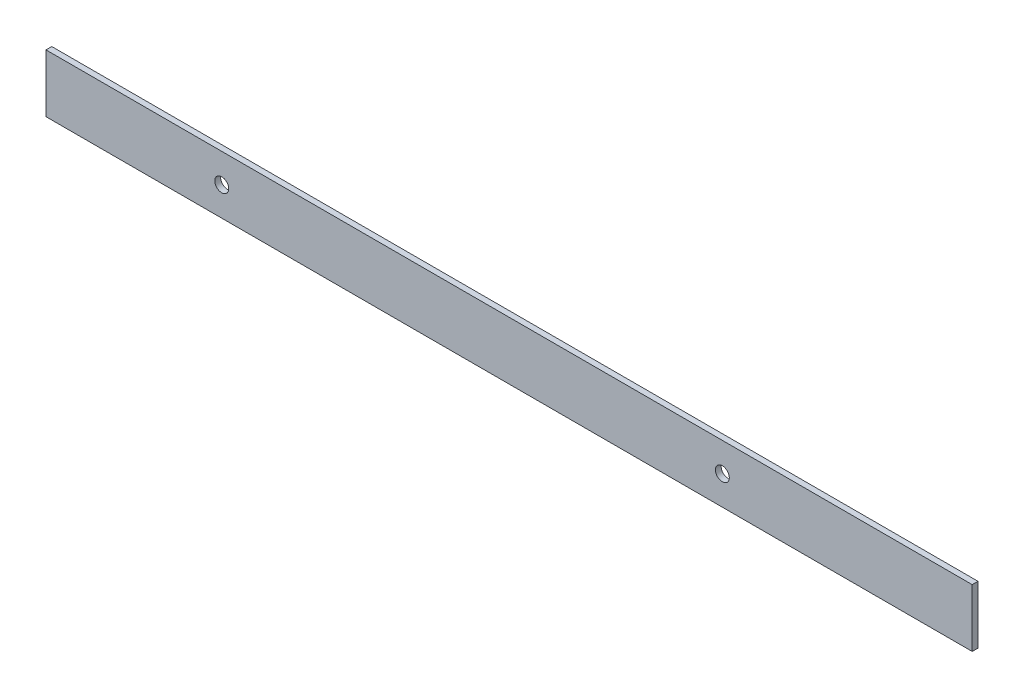
ISO-10303-21;
HEADER;
FILE_DESCRIPTION(('STEP AP214'),'2;1');
FILE_NAME('part.step','',(''),(''),'','','');
FILE_SCHEMA(('AUTOMOTIVE_DESIGN { 1 0 10303 214 1 1 1 1 }'));
ENDSEC;
DATA;
#1=APPLICATION_CONTEXT('core data for automotive mechanical design processes');
#2=APPLICATION_PROTOCOL_DEFINITION('international standard','automotive_design',2000,#1);
#3=PRODUCT_CONTEXT('',#1,'mechanical');
#4=PRODUCT('Part','Part','',(#3));
#5=PRODUCT_RELATED_PRODUCT_CATEGORY('part','',(#4));
#6=PRODUCT_DEFINITION_FORMATION('','',#4);
#7=PRODUCT_DEFINITION_CONTEXT('part definition',#1,'design');
#8=PRODUCT_DEFINITION('design','',#6,#7);
#9=PRODUCT_DEFINITION_SHAPE('','',#8);
#10=(LENGTH_UNIT() NAMED_UNIT(*) SI_UNIT(.MILLI.,.METRE.));
#11=(NAMED_UNIT(*) PLANE_ANGLE_UNIT() SI_UNIT($,.RADIAN.));
#12=(NAMED_UNIT(*) SI_UNIT($,.STERADIAN.) SOLID_ANGLE_UNIT());
#13=UNCERTAINTY_MEASURE_WITH_UNIT(LENGTH_MEASURE(1.E-05),#10,'distance_accuracy_value','');
#14=(GEOMETRIC_REPRESENTATION_CONTEXT(3) GLOBAL_UNCERTAINTY_ASSIGNED_CONTEXT((#13)) GLOBAL_UNIT_ASSIGNED_CONTEXT((#10,
#11,#12)) REPRESENTATION_CONTEXT('',''));
#15=CARTESIAN_POINT('',(0.,0.,0.));
#16=DIRECTION('',(0.,0.,1.));
#17=DIRECTION('',(1.,0.,0.));
#18=AXIS2_PLACEMENT_3D('',#15,#16,#17);
#19=CARTESIAN_POINT('',(0.,50.,5.));
#20=DIRECTION('',(0.,1.,0.));
#21=DIRECTION('',(0.,0.,1.));
#22=AXIS2_PLACEMENT_3D('',#19,#20,#21);
#23=PLANE('',#22);
#24=DIRECTION('',(1.,0.,0.));
#25=VECTOR('',#24,1.);
#26=CARTESIAN_POINT('',(0.,50.,0.));
#27=LINE('',#26,#25);
#28=CARTESIAN_POINT('',(0.,50.,0.));
#29=VERTEX_POINT('',#28);
#30=CARTESIAN_POINT('',(800.,50.,0.));
#31=VERTEX_POINT('',#30);
#32=EDGE_CURVE('E117',#29,#31,#27,.T.);
#33=ORIENTED_EDGE('',*,*,#32,.F.);
#34=DIRECTION('',(0.,0.,-1.));
#35=VECTOR('',#34,1.);
#36=CARTESIAN_POINT('',(0.,50.,5.));
#37=LINE('',#36,#35);
#38=CARTESIAN_POINT('',(0.,50.,5.));
#39=VERTEX_POINT('',#38);
#40=EDGE_CURVE('E11',#39,#29,#37,.T.);
#41=ORIENTED_EDGE('',*,*,#40,.F.);
#42=DIRECTION('',(1.,0.,0.));
#43=VECTOR('',#42,1.);
#44=CARTESIAN_POINT('',(0.,50.,5.));
#45=LINE('',#44,#43);
#46=CARTESIAN_POINT('',(800.,50.,5.));
#47=VERTEX_POINT('',#46);
#48=EDGE_CURVE('E101',#39,#47,#45,.T.);
#49=ORIENTED_EDGE('',*,*,#48,.T.);
#50=DIRECTION('',(0.,0.,-1.));
#51=VECTOR('',#50,1.);
#52=CARTESIAN_POINT('',(800.,50.,5.));
#53=LINE('',#52,#51);
#54=EDGE_CURVE('E78',#47,#31,#53,.T.);
#55=ORIENTED_EDGE('',*,*,#54,.T.);
#56=EDGE_LOOP('',(#33,#41,#49,#55));
#57=FACE_BOUND('',#56,.T.);
#58=ADVANCED_FACE('F38',(#57),#23,.T.);
#59=CARTESIAN_POINT('',(0.,0.,5.));
#60=DIRECTION('',(-1.,0.,0.));
#61=DIRECTION('',(0.,0.,1.));
#62=AXIS2_PLACEMENT_3D('',#59,#60,#61);
#63=PLANE('',#62);
#64=DIRECTION('',(0.,1.,0.));
#65=VECTOR('',#64,1.);
#66=CARTESIAN_POINT('',(0.,0.,0.));
#67=LINE('',#66,#65);
#68=CARTESIAN_POINT('',(0.,0.,0.));
#69=VERTEX_POINT('',#68);
#70=EDGE_CURVE('E90',#69,#29,#67,.T.);
#71=ORIENTED_EDGE('',*,*,#70,.F.);
#72=DIRECTION('',(0.,0.,-1.));
#73=VECTOR('',#72,1.);
#74=CARTESIAN_POINT('',(0.,0.,5.));
#75=LINE('',#74,#73);
#76=CARTESIAN_POINT('',(0.,0.,5.));
#77=VERTEX_POINT('',#76);
#78=EDGE_CURVE('E47',#77,#69,#75,.T.);
#79=ORIENTED_EDGE('',*,*,#78,.F.);
#80=DIRECTION('',(0.,1.,0.));
#81=VECTOR('',#80,1.);
#82=CARTESIAN_POINT('',(0.,0.,5.));
#83=LINE('',#82,#81);
#84=EDGE_CURVE('E88',#77,#39,#83,.T.);
#85=ORIENTED_EDGE('',*,*,#84,.T.);
#86=ORIENTED_EDGE('',*,*,#40,.T.);
#87=EDGE_LOOP('',(#71,#79,#85,#86));
#88=FACE_BOUND('',#87,.T.);
#89=ADVANCED_FACE('F86',(#88),#63,.T.);
#90=CARTESIAN_POINT('',(0.,0.,5.));
#91=DIRECTION('',(0.,1.,0.));
#92=DIRECTION('',(0.,0.,1.));
#93=AXIS2_PLACEMENT_3D('',#90,#91,#92);
#94=PLANE('',#93);
#95=DIRECTION('',(1.,0.,0.));
#96=VECTOR('',#95,1.);
#97=CARTESIAN_POINT('',(0.,0.,0.));
#98=LINE('',#97,#96);
#99=CARTESIAN_POINT('',(800.,0.,0.));
#100=VERTEX_POINT('',#99);
#101=EDGE_CURVE('E121',#69,#100,#98,.T.);
#102=ORIENTED_EDGE('',*,*,#101,.T.);
#103=DIRECTION('',(0.,0.,-1.));
#104=VECTOR('',#103,1.);
#105=CARTESIAN_POINT('',(800.,0.,5.));
#106=LINE('',#105,#104);
#107=CARTESIAN_POINT('',(800.,0.,5.));
#108=VERTEX_POINT('',#107);
#109=EDGE_CURVE('E93',#108,#100,#106,.T.);
#110=ORIENTED_EDGE('',*,*,#109,.F.);
#111=DIRECTION('',(1.,0.,0.));
#112=VECTOR('',#111,1.);
#113=CARTESIAN_POINT('',(0.,0.,5.));
#114=LINE('',#113,#112);
#115=EDGE_CURVE('E95',#77,#108,#114,.T.);
#116=ORIENTED_EDGE('',*,*,#115,.F.);
#117=ORIENTED_EDGE('',*,*,#78,.T.);
#118=EDGE_LOOP('',(#102,#110,#116,#117));
#119=FACE_BOUND('',#118,.T.);
#120=ADVANCED_FACE('F96',(#119),#94,.F.);
#121=CARTESIAN_POINT('',(800.,0.,5.));
#122=DIRECTION('',(-1.,0.,0.));
#123=DIRECTION('',(0.,0.,1.));
#124=AXIS2_PLACEMENT_3D('',#121,#122,#123);
#125=PLANE('',#124);
#126=DIRECTION('',(0.,1.,0.));
#127=VECTOR('',#126,1.);
#128=CARTESIAN_POINT('',(800.,0.,0.));
#129=LINE('',#128,#127);
#130=EDGE_CURVE('E71',#100,#31,#129,.T.);
#131=ORIENTED_EDGE('',*,*,#130,.T.);
#132=ORIENTED_EDGE('',*,*,#54,.F.);
#133=DIRECTION('',(0.,1.,0.));
#134=VECTOR('',#133,1.);
#135=CARTESIAN_POINT('',(800.,0.,5.));
#136=LINE('',#135,#134);
#137=EDGE_CURVE('E55',#108,#47,#136,.T.);
#138=ORIENTED_EDGE('',*,*,#137,.F.);
#139=ORIENTED_EDGE('',*,*,#109,.T.);
#140=EDGE_LOOP('',(#131,#132,#138,#139));
#141=FACE_BOUND('',#140,.T.);
#142=ADVANCED_FACE('F131',(#141),#125,.F.);
#143=CARTESIAN_POINT('',(151.798792625695,25.0026800815724,5.));
#144=DIRECTION('',(0.,0.,-1.));
#145=DIRECTION('',(-1.,0.,0.));
#146=AXIS2_PLACEMENT_3D('',#143,#144,#145);
#147=CYLINDRICAL_SURFACE('',#146,6.00000000000002);
#148=CARTESIAN_POINT('',(151.798792625695,25.0026800815724,5.));
#149=DIRECTION('',(0.,0.,1.));
#150=DIRECTION('',(1.,0.,0.));
#151=AXIS2_PLACEMENT_3D('',#148,#149,#150);
#152=CIRCLE('',#151,6.00000000000002);
#153=CARTESIAN_POINT('',(157.798792625695,25.0026800815724,5.));
#154=VERTEX_POINT('',#153);
#155=EDGE_CURVE('E104',#154,#154,#152,.T.);
#156=ORIENTED_EDGE('',*,*,#155,.T.);
#157=EDGE_LOOP('',(#156));
#158=FACE_BOUND('',#157,.T.);
#159=CARTESIAN_POINT('',(151.798792625695,25.0026800815724,0.));
#160=DIRECTION('',(0.,0.,1.));
#161=DIRECTION('',(1.,0.,0.));
#162=AXIS2_PLACEMENT_3D('',#159,#160,#161);
#163=CIRCLE('',#162,6.00000000000002);
#164=CARTESIAN_POINT('',(157.798792625695,25.0026800815724,0.));
#165=VERTEX_POINT('',#164);
#166=EDGE_CURVE('E113',#165,#165,#163,.T.);
#167=ORIENTED_EDGE('',*,*,#166,.F.);
#168=EDGE_LOOP('',(#167));
#169=FACE_BOUND('',#168,.T.);
#170=ADVANCED_FACE('F40',(#158,#169),#147,.F.);
#171=CARTESIAN_POINT('',(584.176275293685,25.0026800815726,5.));
#172=DIRECTION('',(0.,0.,-1.));
#173=DIRECTION('',(-1.,0.,0.));
#174=AXIS2_PLACEMENT_3D('',#171,#172,#173);
#175=CYLINDRICAL_SURFACE('',#174,5.99999999999999);
#176=CARTESIAN_POINT('',(584.176275293685,25.0026800815726,5.));
#177=DIRECTION('',(0.,0.,1.));
#178=DIRECTION('',(1.,0.,0.));
#179=AXIS2_PLACEMENT_3D('',#176,#177,#178);
#180=CIRCLE('',#179,5.99999999999999);
#181=CARTESIAN_POINT('',(590.176275293685,25.0026800815726,5.));
#182=VERTEX_POINT('',#181);
#183=EDGE_CURVE('E109',#182,#182,#180,.T.);
#184=ORIENTED_EDGE('',*,*,#183,.T.);
#185=EDGE_LOOP('',(#184));
#186=FACE_BOUND('',#185,.T.);
#187=CARTESIAN_POINT('',(584.176275293685,25.0026800815726,0.));
#188=DIRECTION('',(0.,0.,1.));
#189=DIRECTION('',(1.,0.,0.));
#190=AXIS2_PLACEMENT_3D('',#187,#188,#189);
#191=CIRCLE('',#190,5.99999999999999);
#192=CARTESIAN_POINT('',(590.176275293685,25.0026800815726,0.));
#193=VERTEX_POINT('',#192);
#194=EDGE_CURVE('E125',#193,#193,#191,.T.);
#195=ORIENTED_EDGE('',*,*,#194,.F.);
#196=EDGE_LOOP('',(#195));
#197=FACE_BOUND('',#196,.T.);
#198=ADVANCED_FACE('F144',(#186,#197),#175,.F.);
#199=CARTESIAN_POINT('',(0.,0.,5.));
#200=DIRECTION('',(0.,0.,1.));
#201=DIRECTION('',(1.,0.,0.));
#202=AXIS2_PLACEMENT_3D('',#199,#200,#201);
#203=PLANE('',#202);
#204=ORIENTED_EDGE('',*,*,#155,.F.);
#205=EDGE_LOOP('',(#204));
#206=FACE_BOUND('',#205,.T.);
#207=ORIENTED_EDGE('',*,*,#48,.F.);
#208=ORIENTED_EDGE('',*,*,#84,.F.);
#209=ORIENTED_EDGE('',*,*,#115,.T.);
#210=ORIENTED_EDGE('',*,*,#137,.T.);
#211=EDGE_LOOP('',(#207,#208,#209,#210));
#212=FACE_BOUND('',#211,.T.);
#213=ORIENTED_EDGE('',*,*,#183,.F.);
#214=EDGE_LOOP('',(#213));
#215=FACE_BOUND('',#214,.T.);
#216=ADVANCED_FACE('F99',(#206,#212,#215),#203,.T.);
#217=CARTESIAN_POINT('',(0.,0.,0.));
#218=DIRECTION('',(0.,0.,1.));
#219=DIRECTION('',(1.,0.,0.));
#220=AXIS2_PLACEMENT_3D('',#217,#218,#219);
#221=PLANE('',#220);
#222=ORIENTED_EDGE('',*,*,#166,.T.);
#223=EDGE_LOOP('',(#222));
#224=FACE_BOUND('',#223,.T.);
#225=ORIENTED_EDGE('',*,*,#32,.T.);
#226=ORIENTED_EDGE('',*,*,#130,.F.);
#227=ORIENTED_EDGE('',*,*,#101,.F.);
#228=ORIENTED_EDGE('',*,*,#70,.T.);
#229=EDGE_LOOP('',(#225,#226,#227,#228));
#230=FACE_BOUND('',#229,.T.);
#231=ORIENTED_EDGE('',*,*,#194,.T.);
#232=EDGE_LOOP('',(#231));
#233=FACE_BOUND('',#232,.T.);
#234=ADVANCED_FACE('F132',(#224,#230,#233),#221,.F.);
#235=CLOSED_SHELL('',(#58,#89,#120,#142,#170,#198,#216,#234));
#236=MANIFOLD_SOLID_BREP('B2',#235);
#237=ADVANCED_BREP_SHAPE_REPRESENTATION('',(#18,#236),#14);
#238=SHAPE_DEFINITION_REPRESENTATION(#9,#237);
ENDSEC;
END-ISO-10303-21;
